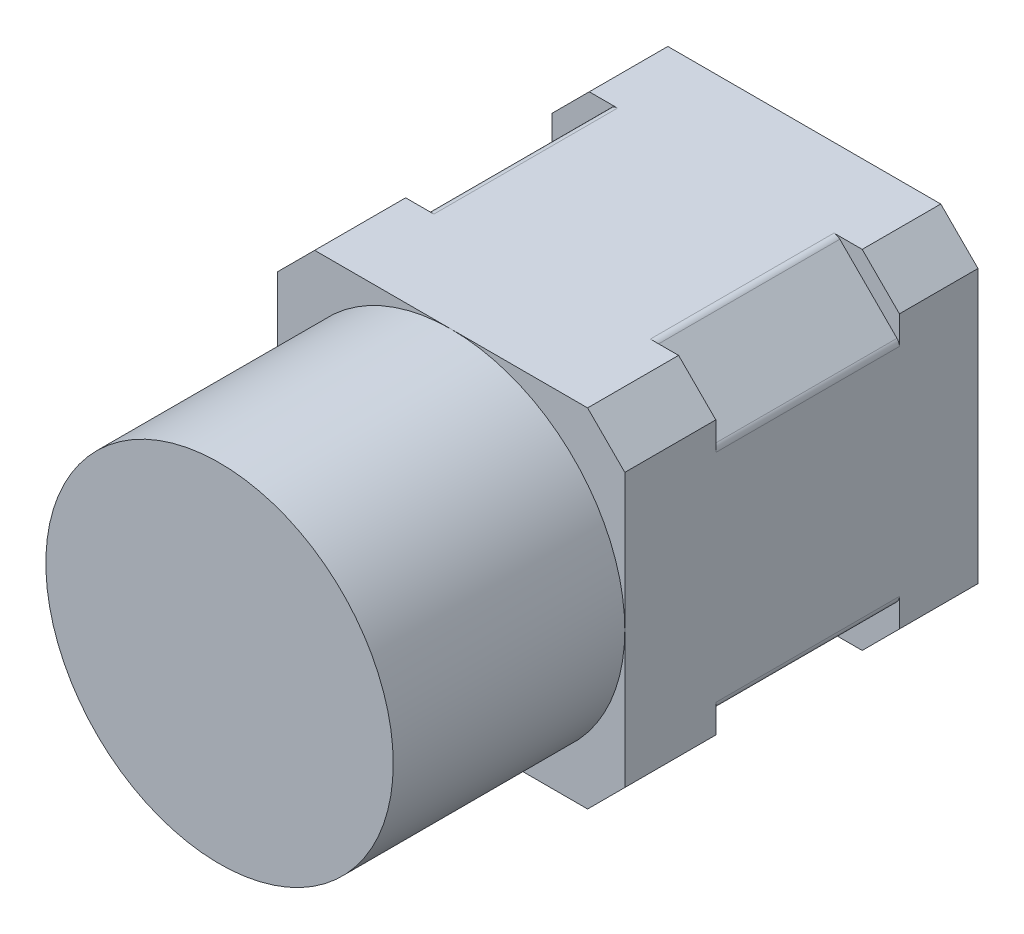
ISO-10303-21;
HEADER;
FILE_DESCRIPTION(('STEP AP214'),'2;1');
FILE_NAME('part.step','',(''),(''),'','','');
FILE_SCHEMA(('AUTOMOTIVE_DESIGN { 1 0 10303 214 1 1 1 1 }'));
ENDSEC;
DATA;
#1=APPLICATION_CONTEXT('core data for automotive mechanical design processes');
#2=APPLICATION_PROTOCOL_DEFINITION('international standard','automotive_design',2000,#1);
#3=PRODUCT_CONTEXT('',#1,'mechanical');
#4=PRODUCT('Part','Part','',(#3));
#5=PRODUCT_RELATED_PRODUCT_CATEGORY('part','',(#4));
#6=PRODUCT_DEFINITION_FORMATION('','',#4);
#7=PRODUCT_DEFINITION_CONTEXT('part definition',#1,'design');
#8=PRODUCT_DEFINITION('design','',#6,#7);
#9=PRODUCT_DEFINITION_SHAPE('','',#8);
#10=(LENGTH_UNIT() NAMED_UNIT(*) SI_UNIT(.MILLI.,.METRE.));
#11=(NAMED_UNIT(*) PLANE_ANGLE_UNIT() SI_UNIT($,.RADIAN.));
#12=(NAMED_UNIT(*) SI_UNIT($,.STERADIAN.) SOLID_ANGLE_UNIT());
#13=UNCERTAINTY_MEASURE_WITH_UNIT(LENGTH_MEASURE(1.E-05),#10,'distance_accuracy_value','');
#14=(GEOMETRIC_REPRESENTATION_CONTEXT(3) GLOBAL_UNCERTAINTY_ASSIGNED_CONTEXT((#13)) GLOBAL_UNIT_ASSIGNED_CONTEXT((#10,
#11,#12)) REPRESENTATION_CONTEXT('',''));
#15=CARTESIAN_POINT('',(0.,0.,0.));
#16=DIRECTION('',(0.,0.,1.));
#17=DIRECTION('',(1.,0.,0.));
#18=AXIS2_PLACEMENT_3D('',#15,#16,#17);
#19=CARTESIAN_POINT('',(0.,0.,33.2));
#20=DIRECTION('',(0.,0.,-1.));
#21=DIRECTION('',(-1.,0.,0.));
#22=AXIS2_PLACEMENT_3D('',#19,#20,#21);
#23=PLANE('',#22);
#24=CARTESIAN_POINT('',(0.,0.,33.2));
#25=DIRECTION('',(0.,0.,1.));
#26=DIRECTION('',(1.,0.,0.));
#27=AXIS2_PLACEMENT_3D('',#24,#25,#26);
#28=CIRCLE('',#27,21.);
#29=CARTESIAN_POINT('',(21.,0.,33.2));
#30=VERTEX_POINT('',#29);
#31=CARTESIAN_POINT('',(0.,21.,33.2));
#32=VERTEX_POINT('',#31);
#33=EDGE_CURVE('E57',#30,#32,#28,.T.);
#34=ORIENTED_EDGE('',*,*,#33,.F.);
#35=DIRECTION('',(0.,1.,0.));
#36=VECTOR('',#35,1.);
#37=CARTESIAN_POINT('',(21.,16.5,33.2));
#38=LINE('',#37,#36);
#39=CARTESIAN_POINT('',(21.,16.5,33.2));
#40=VERTEX_POINT('',#39);
#41=EDGE_CURVE('E277',#30,#40,#38,.T.);
#42=ORIENTED_EDGE('',*,*,#41,.T.);
#43=DIRECTION('',(-0.707106781186549,0.707106781186546,0.));
#44=VECTOR('',#43,1.);
#45=CARTESIAN_POINT('',(16.5,21.,33.2));
#46=LINE('',#45,#44);
#47=CARTESIAN_POINT('',(16.5,21.,33.2));
#48=VERTEX_POINT('',#47);
#49=EDGE_CURVE('E276',#40,#48,#46,.T.);
#50=ORIENTED_EDGE('',*,*,#49,.T.);
#51=DIRECTION('',(-1.,0.,0.));
#52=VECTOR('',#51,1.);
#53=CARTESIAN_POINT('',(-16.5,21.,33.2));
#54=LINE('',#53,#52);
#55=EDGE_CURVE('E290',#48,#32,#54,.T.);
#56=ORIENTED_EDGE('',*,*,#55,.T.);
#57=EDGE_LOOP('',(#34,#42,#50,#56));
#58=FACE_BOUND('',#57,.T.);
#59=ADVANCED_FACE('F45',(#58),#23,.F.);
#60=CARTESIAN_POINT('',(-21.,0.,33.2));
#61=VERTEX_POINT('',#60);
#62=EDGE_CURVE('E11',#32,#61,#28,.T.);
#63=ORIENTED_EDGE('',*,*,#62,.F.);
#64=CARTESIAN_POINT('',(-16.5,21.,33.2));
#65=VERTEX_POINT('',#64);
#66=EDGE_CURVE('E318',#32,#65,#54,.T.);
#67=ORIENTED_EDGE('',*,*,#66,.T.);
#68=DIRECTION('',(-0.707106781186547,-0.707106781186548,0.));
#69=VECTOR('',#68,1.);
#70=CARTESIAN_POINT('',(-21.,16.5,33.2));
#71=LINE('',#70,#69);
#72=CARTESIAN_POINT('',(-21.,16.5,33.2));
#73=VERTEX_POINT('',#72);
#74=EDGE_CURVE('E321',#65,#73,#71,.T.);
#75=ORIENTED_EDGE('',*,*,#74,.T.);
#76=DIRECTION('',(0.,-1.,0.));
#77=VECTOR('',#76,1.);
#78=CARTESIAN_POINT('',(-21.,-16.5,33.2));
#79=LINE('',#78,#77);
#80=EDGE_CURVE('E302',#73,#61,#79,.T.);
#81=ORIENTED_EDGE('',*,*,#80,.T.);
#82=EDGE_LOOP('',(#63,#67,#75,#81));
#83=FACE_BOUND('',#82,.T.);
#84=ADVANCED_FACE('F651',(#83),#23,.F.);
#85=CARTESIAN_POINT('',(0.,-21.,33.2));
#86=VERTEX_POINT('',#85);
#87=EDGE_CURVE('E55',#61,#86,#28,.T.);
#88=ORIENTED_EDGE('',*,*,#87,.F.);
#89=CARTESIAN_POINT('',(-21.,-16.5,33.2));
#90=VERTEX_POINT('',#89);
#91=EDGE_CURVE('E306',#61,#90,#79,.T.);
#92=ORIENTED_EDGE('',*,*,#91,.T.);
#93=DIRECTION('',(0.707106781186549,-0.707106781186546,0.));
#94=VECTOR('',#93,1.);
#95=CARTESIAN_POINT('',(-16.5,-21.,33.2));
#96=LINE('',#95,#94);
#97=CARTESIAN_POINT('',(-16.5,-21.,33.2));
#98=VERTEX_POINT('',#97);
#99=EDGE_CURVE('E305',#90,#98,#96,.T.);
#100=ORIENTED_EDGE('',*,*,#99,.T.);
#101=DIRECTION('',(1.,0.,0.));
#102=VECTOR('',#101,1.);
#103=CARTESIAN_POINT('',(16.5,-21.,33.2));
#104=LINE('',#103,#102);
#105=EDGE_CURVE('E310',#98,#86,#104,.T.);
#106=ORIENTED_EDGE('',*,*,#105,.T.);
#107=EDGE_LOOP('',(#88,#92,#100,#106));
#108=FACE_BOUND('',#107,.T.);
#109=ADVANCED_FACE('F655',(#108),#23,.F.);
#110=CARTESIAN_POINT('',(0.,0.,0.));
#111=DIRECTION('',(0.,0.,-1.));
#112=DIRECTION('',(-1.,0.,0.));
#113=AXIS2_PLACEMENT_3D('',#110,#111,#112);
#114=PLANE('',#113);
#115=DIRECTION('',(-0.707106781186547,-0.707106781186547,0.));
#116=VECTOR('',#115,1.);
#117=CARTESIAN_POINT('',(-13.5,21.,0.));
#118=LINE('',#117,#116);
#119=CARTESIAN_POINT('',(-13.7928932188135,20.7071067811865,0.));
#120=VERTEX_POINT('',#119);
#121=CARTESIAN_POINT('',(-20.7071067811866,13.7928932188135,0.));
#122=VERTEX_POINT('',#121);
#123=EDGE_CURVE('E385',#120,#122,#118,.T.);
#124=ORIENTED_EDGE('',*,*,#123,.F.);
#125=CARTESIAN_POINT('',(-13.0857864376269,20.,0.));
#126=DIRECTION('',(0.,0.,-1.));
#127=DIRECTION('',(-1.,0.,0.));
#128=AXIS2_PLACEMENT_3D('',#125,#126,#127);
#129=CIRCLE('',#128,1.);
#130=CARTESIAN_POINT('',(-13.0857864376269,21.,0.));
#131=VERTEX_POINT('',#130);
#132=EDGE_CURVE('E606',#120,#131,#129,.T.);
#133=ORIENTED_EDGE('',*,*,#132,.T.);
#134=DIRECTION('',(-1.,0.,0.));
#135=VECTOR('',#134,1.);
#136=CARTESIAN_POINT('',(21.,21.,0.));
#137=LINE('',#136,#135);
#138=CARTESIAN_POINT('',(-16.5,21.,0.));
#139=VERTEX_POINT('',#138);
#140=EDGE_CURVE('E439',#131,#139,#137,.T.);
#141=ORIENTED_EDGE('',*,*,#140,.T.);
#142=DIRECTION('',(0.707106781186546,0.707106781186549,0.));
#143=VECTOR('',#142,1.);
#144=CARTESIAN_POINT('',(-16.5,21.,0.));
#145=LINE('',#144,#143);
#146=CARTESIAN_POINT('',(-21.,16.5,0.));
#147=VERTEX_POINT('',#146);
#148=EDGE_CURVE('E459',#139,#147,#145,.F.);
#149=ORIENTED_EDGE('',*,*,#148,.T.);
#150=DIRECTION('',(0.,-1.,0.));
#151=VECTOR('',#150,1.);
#152=CARTESIAN_POINT('',(-21.,21.,0.));
#153=LINE('',#152,#151);
#154=CARTESIAN_POINT('',(-21.,13.0857864376269,0.));
#155=VERTEX_POINT('',#154);
#156=EDGE_CURVE('E444',#147,#155,#153,.T.);
#157=ORIENTED_EDGE('',*,*,#156,.T.);
#158=CARTESIAN_POINT('',(-20.,13.0857864376269,0.));
#159=DIRECTION('',(0.,0.,-1.));
#160=DIRECTION('',(-1.,0.,0.));
#161=AXIS2_PLACEMENT_3D('',#158,#159,#160);
#162=CIRCLE('',#161,1.);
#163=EDGE_CURVE('E603',#155,#122,#162,.T.);
#164=ORIENTED_EDGE('',*,*,#163,.T.);
#165=EDGE_LOOP('',(#124,#133,#141,#149,#157,#164));
#166=FACE_BOUND('',#165,.T.);
#167=ADVANCED_FACE('F665',(#166),#114,.F.);
#168=DIRECTION('',(-0.707106781186547,0.707106781186547,0.));
#169=VECTOR('',#168,1.);
#170=CARTESIAN_POINT('',(21.,13.5,0.));
#171=LINE('',#170,#169);
#172=CARTESIAN_POINT('',(20.7071067811865,13.7928932188135,0.));
#173=VERTEX_POINT('',#172);
#174=CARTESIAN_POINT('',(13.7928932188135,20.7071067811866,0.));
#175=VERTEX_POINT('',#174);
#176=EDGE_CURVE('E391',#173,#175,#171,.T.);
#177=ORIENTED_EDGE('',*,*,#176,.F.);
#178=CARTESIAN_POINT('',(20.,13.0857864376269,0.));
#179=DIRECTION('',(0.,0.,-1.));
#180=DIRECTION('',(-1.,0.,0.));
#181=AXIS2_PLACEMENT_3D('',#178,#179,#180);
#182=CIRCLE('',#181,1.);
#183=CARTESIAN_POINT('',(21.,13.0857864376269,0.));
#184=VERTEX_POINT('',#183);
#185=EDGE_CURVE('E299',#173,#184,#182,.T.);
#186=ORIENTED_EDGE('',*,*,#185,.T.);
#187=DIRECTION('',(0.,1.,0.));
#188=VECTOR('',#187,1.);
#189=CARTESIAN_POINT('',(21.,21.,0.));
#190=LINE('',#189,#188);
#191=CARTESIAN_POINT('',(21.,16.5,0.));
#192=VERTEX_POINT('',#191);
#193=EDGE_CURVE('E403',#184,#192,#190,.T.);
#194=ORIENTED_EDGE('',*,*,#193,.T.);
#195=DIRECTION('',(0.707106781186549,-0.707106781186546,0.));
#196=VECTOR('',#195,1.);
#197=CARTESIAN_POINT('',(21.,16.5,0.));
#198=LINE('',#197,#196);
#199=CARTESIAN_POINT('',(16.5,21.,0.));
#200=VERTEX_POINT('',#199);
#201=EDGE_CURVE('E456',#192,#200,#198,.F.);
#202=ORIENTED_EDGE('',*,*,#201,.T.);
#203=CARTESIAN_POINT('',(13.0857864376269,21.,0.));
#204=VERTEX_POINT('',#203);
#205=EDGE_CURVE('E440',#200,#204,#137,.T.);
#206=ORIENTED_EDGE('',*,*,#205,.T.);
#207=CARTESIAN_POINT('',(13.0857864376269,20.,0.));
#208=DIRECTION('',(0.,0.,-1.));
#209=DIRECTION('',(-1.,0.,0.));
#210=AXIS2_PLACEMENT_3D('',#207,#208,#209);
#211=CIRCLE('',#210,1.);
#212=EDGE_CURVE('E49',#204,#175,#211,.T.);
#213=ORIENTED_EDGE('',*,*,#212,.T.);
#214=EDGE_LOOP('',(#177,#186,#194,#202,#206,#213));
#215=FACE_BOUND('',#214,.T.);
#216=ADVANCED_FACE('F614',(#215),#114,.F.);
#217=DIRECTION('',(0.707106781186547,0.707106781186547,0.));
#218=VECTOR('',#217,1.);
#219=CARTESIAN_POINT('',(21.,-13.5,0.));
#220=LINE('',#219,#218);
#221=CARTESIAN_POINT('',(13.7928932188135,-20.7071067811865,0.));
#222=VERTEX_POINT('',#221);
#223=CARTESIAN_POINT('',(20.7071067811865,-13.7928932188135,0.));
#224=VERTEX_POINT('',#223);
#225=EDGE_CURVE('E411',#222,#224,#220,.T.);
#226=ORIENTED_EDGE('',*,*,#225,.F.);
#227=CARTESIAN_POINT('',(13.0857864376269,-20.,0.));
#228=DIRECTION('',(0.,0.,-1.));
#229=DIRECTION('',(-1.,0.,0.));
#230=AXIS2_PLACEMENT_3D('',#227,#228,#229);
#231=CIRCLE('',#230,1.);
#232=CARTESIAN_POINT('',(13.0857864376269,-21.,0.));
#233=VERTEX_POINT('',#232);
#234=EDGE_CURVE('E592',#222,#233,#231,.T.);
#235=ORIENTED_EDGE('',*,*,#234,.T.);
#236=DIRECTION('',(1.,0.,0.));
#237=VECTOR('',#236,1.);
#238=CARTESIAN_POINT('',(21.,-21.,0.));
#239=LINE('',#238,#237);
#240=CARTESIAN_POINT('',(16.5,-21.,0.));
#241=VERTEX_POINT('',#240);
#242=EDGE_CURVE('E447',#233,#241,#239,.T.);
#243=ORIENTED_EDGE('',*,*,#242,.T.);
#244=DIRECTION('',(-0.707106781186546,-0.707106781186549,0.));
#245=VECTOR('',#244,1.);
#246=CARTESIAN_POINT('',(16.5,-21.,0.));
#247=LINE('',#246,#245);
#248=CARTESIAN_POINT('',(21.,-16.5,0.));
#249=VERTEX_POINT('',#248);
#250=EDGE_CURVE('E462',#241,#249,#247,.F.);
#251=ORIENTED_EDGE('',*,*,#250,.T.);
#252=CARTESIAN_POINT('',(21.,-13.0857864376269,0.));
#253=VERTEX_POINT('',#252);
#254=EDGE_CURVE('E436',#249,#253,#190,.T.);
#255=ORIENTED_EDGE('',*,*,#254,.T.);
#256=CARTESIAN_POINT('',(20.,-13.0857864376269,0.));
#257=DIRECTION('',(0.,0.,-1.));
#258=DIRECTION('',(-1.,0.,0.));
#259=AXIS2_PLACEMENT_3D('',#256,#257,#258);
#260=CIRCLE('',#259,1.);
#261=EDGE_CURVE('E589',#253,#224,#260,.T.);
#262=ORIENTED_EDGE('',*,*,#261,.T.);
#263=EDGE_LOOP('',(#226,#235,#243,#251,#255,#262));
#264=FACE_BOUND('',#263,.T.);
#265=ADVANCED_FACE('F758',(#264),#114,.F.);
#266=DIRECTION('',(0.707106781186547,-0.707106781186547,0.));
#267=VECTOR('',#266,1.);
#268=CARTESIAN_POINT('',(-13.5,-21.,0.));
#269=LINE('',#268,#267);
#270=CARTESIAN_POINT('',(-20.7071067811865,-13.7928932188135,0.));
#271=VERTEX_POINT('',#270);
#272=CARTESIAN_POINT('',(-13.7928932188135,-20.7071067811865,0.));
#273=VERTEX_POINT('',#272);
#274=EDGE_CURVE('E407',#271,#273,#269,.T.);
#275=ORIENTED_EDGE('',*,*,#274,.F.);
#276=CARTESIAN_POINT('',(-20.,-13.0857864376269,0.));
#277=DIRECTION('',(0.,0.,-1.));
#278=DIRECTION('',(-1.,0.,0.));
#279=AXIS2_PLACEMENT_3D('',#276,#277,#278);
#280=CIRCLE('',#279,1.);
#281=CARTESIAN_POINT('',(-21.,-13.0857864376269,0.));
#282=VERTEX_POINT('',#281);
#283=EDGE_CURVE('E599',#271,#282,#280,.T.);
#284=ORIENTED_EDGE('',*,*,#283,.T.);
#285=CARTESIAN_POINT('',(-21.,-16.5,0.));
#286=VERTEX_POINT('',#285);
#287=EDGE_CURVE('E443',#282,#286,#153,.T.);
#288=ORIENTED_EDGE('',*,*,#287,.T.);
#289=DIRECTION('',(-0.707106781186549,0.707106781186546,0.));
#290=VECTOR('',#289,1.);
#291=CARTESIAN_POINT('',(-21.,-16.5,0.));
#292=LINE('',#291,#290);
#293=CARTESIAN_POINT('',(-16.5,-21.,0.));
#294=VERTEX_POINT('',#293);
#295=EDGE_CURVE('E465',#286,#294,#292,.F.);
#296=ORIENTED_EDGE('',*,*,#295,.T.);
#297=CARTESIAN_POINT('',(-13.0857864376269,-21.,0.));
#298=VERTEX_POINT('',#297);
#299=EDGE_CURVE('E423',#294,#298,#239,.T.);
#300=ORIENTED_EDGE('',*,*,#299,.T.);
#301=CARTESIAN_POINT('',(-13.0857864376269,-20.,0.));
#302=DIRECTION('',(0.,0.,-1.));
#303=DIRECTION('',(-1.,0.,0.));
#304=AXIS2_PLACEMENT_3D('',#301,#302,#303);
#305=CIRCLE('',#304,1.);
#306=EDGE_CURVE('E596',#298,#273,#305,.T.);
#307=ORIENTED_EDGE('',*,*,#306,.T.);
#308=EDGE_LOOP('',(#275,#284,#288,#296,#300,#307));
#309=FACE_BOUND('',#308,.T.);
#310=ADVANCED_FACE('F672',(#309),#114,.F.);
#311=CARTESIAN_POINT('',(21.,21.,-9.5));
#312=DIRECTION('',(1.,0.,0.));
#313=DIRECTION('',(0.,1.,0.));
#314=AXIS2_PLACEMENT_3D('',#311,#312,#313);
#315=PLANE('',#314);
#316=DIRECTION('',(0.,0.,-1.));
#317=VECTOR('',#316,1.);
#318=CARTESIAN_POINT('',(21.,13.0857864376269,22.2));
#319=LINE('',#318,#317);
#320=CARTESIAN_POINT('',(21.,13.0857864376269,22.2));
#321=VERTEX_POINT('',#320);
#322=EDGE_CURVE('E501',#184,#321,#319,.F.);
#323=ORIENTED_EDGE('',*,*,#322,.T.);
#324=DIRECTION('',(0.,1.,0.));
#325=VECTOR('',#324,1.);
#326=CARTESIAN_POINT('',(21.,16.5,22.2));
#327=LINE('',#326,#325);
#328=CARTESIAN_POINT('',(21.,16.5,22.2));
#329=VERTEX_POINT('',#328);
#330=EDGE_CURVE('E341',#321,#329,#327,.T.);
#331=ORIENTED_EDGE('',*,*,#330,.T.);
#332=DIRECTION('',(0.,0.,-1.));
#333=VECTOR('',#332,1.);
#334=CARTESIAN_POINT('',(21.,16.5,33.2));
#335=LINE('',#334,#333);
#336=EDGE_CURVE('E283',#40,#329,#335,.T.);
#337=ORIENTED_EDGE('',*,*,#336,.F.);
#338=ORIENTED_EDGE('',*,*,#41,.F.);
#339=CARTESIAN_POINT('',(21.,-16.5,33.2));
#340=VERTEX_POINT('',#339);
#341=EDGE_CURVE('E267',#340,#30,#38,.T.);
#342=ORIENTED_EDGE('',*,*,#341,.F.);
#343=DIRECTION('',(0.,0.,-1.));
#344=VECTOR('',#343,1.);
#345=CARTESIAN_POINT('',(21.,-16.5,33.2));
#346=LINE('',#345,#344);
#347=CARTESIAN_POINT('',(21.,-16.5,22.2));
#348=VERTEX_POINT('',#347);
#349=EDGE_CURVE('E370',#340,#348,#346,.T.);
#350=ORIENTED_EDGE('',*,*,#349,.T.);
#351=CARTESIAN_POINT('',(21.,-13.0857864376269,22.2));
#352=VERTEX_POINT('',#351);
#353=EDGE_CURVE('E342',#348,#352,#327,.T.);
#354=ORIENTED_EDGE('',*,*,#353,.T.);
#355=DIRECTION('',(0.,0.,-1.));
#356=VECTOR('',#355,1.);
#357=CARTESIAN_POINT('',(21.,-13.0857864376269,0.));
#358=LINE('',#357,#356);
#359=EDGE_CURVE('E504',#352,#253,#358,.T.);
#360=ORIENTED_EDGE('',*,*,#359,.T.);
#361=ORIENTED_EDGE('',*,*,#254,.F.);
#362=DIRECTION('',(0.,0.,-1.));
#363=VECTOR('',#362,1.);
#364=CARTESIAN_POINT('',(21.,-16.5,-9.5));
#365=LINE('',#364,#363);
#366=CARTESIAN_POINT('',(21.,-16.5,-9.5));
#367=VERTEX_POINT('',#366);
#368=EDGE_CURVE('E491',#249,#367,#365,.T.);
#369=ORIENTED_EDGE('',*,*,#368,.T.);
#370=DIRECTION('',(0.,1.,0.));
#371=VECTOR('',#370,1.);
#372=CARTESIAN_POINT('',(21.,21.,-9.5));
#373=LINE('',#372,#371);
#374=CARTESIAN_POINT('',(21.,16.5,-9.5));
#375=VERTEX_POINT('',#374);
#376=EDGE_CURVE('E418',#367,#375,#373,.T.);
#377=ORIENTED_EDGE('',*,*,#376,.T.);
#378=DIRECTION('',(0.,0.,1.));
#379=VECTOR('',#378,1.);
#380=CARTESIAN_POINT('',(21.,16.5,-9.5));
#381=LINE('',#380,#379);
#382=EDGE_CURVE('E487',#375,#192,#381,.T.);
#383=ORIENTED_EDGE('',*,*,#382,.T.);
#384=ORIENTED_EDGE('',*,*,#193,.F.);
#385=EDGE_LOOP('',(#323,#331,#337,#338,#342,#350,#354,#360,#361,#369,#377,#383,#384));
#386=FACE_BOUND('',#385,.T.);
#387=ADVANCED_FACE('F281',(#386),#315,.T.);
#388=CARTESIAN_POINT('',(21.,-21.,-9.5));
#389=DIRECTION('',(0.,-1.,0.));
#390=DIRECTION('',(1.,0.,0.));
#391=AXIS2_PLACEMENT_3D('',#388,#389,#390);
#392=PLANE('',#391);
#393=ORIENTED_EDGE('',*,*,#242,.F.);
#394=DIRECTION('',(0.,0.,-1.));
#395=VECTOR('',#394,1.);
#396=CARTESIAN_POINT('',(13.0857864376269,-21.,22.2));
#397=LINE('',#396,#395);
#398=CARTESIAN_POINT('',(13.0857864376269,-21.,22.2));
#399=VERTEX_POINT('',#398);
#400=EDGE_CURVE('E551',#233,#399,#397,.F.);
#401=ORIENTED_EDGE('',*,*,#400,.T.);
#402=DIRECTION('',(1.,0.,0.));
#403=VECTOR('',#402,1.);
#404=CARTESIAN_POINT('',(16.5,-21.,22.2));
#405=LINE('',#404,#403);
#406=CARTESIAN_POINT('',(16.5,-21.,22.2));
#407=VERTEX_POINT('',#406);
#408=EDGE_CURVE('E333',#399,#407,#405,.T.);
#409=ORIENTED_EDGE('',*,*,#408,.T.);
#410=DIRECTION('',(0.,0.,-1.));
#411=VECTOR('',#410,1.);
#412=CARTESIAN_POINT('',(16.5,-21.,33.2));
#413=LINE('',#412,#411);
#414=CARTESIAN_POINT('',(16.5,-21.,33.2));
#415=VERTEX_POINT('',#414);
#416=EDGE_CURVE('E373',#415,#407,#413,.T.);
#417=ORIENTED_EDGE('',*,*,#416,.F.);
#418=EDGE_CURVE('E309',#86,#415,#104,.T.);
#419=ORIENTED_EDGE('',*,*,#418,.F.);
#420=ORIENTED_EDGE('',*,*,#105,.F.);
#421=DIRECTION('',(0.,0.,-1.));
#422=VECTOR('',#421,1.);
#423=CARTESIAN_POINT('',(-16.5,-21.,33.2));
#424=LINE('',#423,#422);
#425=CARTESIAN_POINT('',(-16.5,-21.,22.2));
#426=VERTEX_POINT('',#425);
#427=EDGE_CURVE('E377',#98,#426,#424,.T.);
#428=ORIENTED_EDGE('',*,*,#427,.T.);
#429=CARTESIAN_POINT('',(-13.0857864376269,-21.,22.2));
#430=VERTEX_POINT('',#429);
#431=EDGE_CURVE('E334',#426,#430,#405,.T.);
#432=ORIENTED_EDGE('',*,*,#431,.T.);
#433=DIRECTION('',(0.,0.,-1.));
#434=VECTOR('',#433,1.);
#435=CARTESIAN_POINT('',(-13.0857864376269,-21.,0.));
#436=LINE('',#435,#434);
#437=EDGE_CURVE('E547',#430,#298,#436,.T.);
#438=ORIENTED_EDGE('',*,*,#437,.T.);
#439=ORIENTED_EDGE('',*,*,#299,.F.);
#440=DIRECTION('',(0.,0.,-1.));
#441=VECTOR('',#440,1.);
#442=CARTESIAN_POINT('',(-16.5,-21.,-9.5));
#443=LINE('',#442,#441);
#444=CARTESIAN_POINT('',(-16.5,-21.,-9.5));
#445=VERTEX_POINT('',#444);
#446=EDGE_CURVE('E472',#294,#445,#443,.T.);
#447=ORIENTED_EDGE('',*,*,#446,.T.);
#448=DIRECTION('',(1.,0.,0.));
#449=VECTOR('',#448,1.);
#450=CARTESIAN_POINT('',(21.,-21.,-9.5));
#451=LINE('',#450,#449);
#452=CARTESIAN_POINT('',(16.5,-21.,-9.5));
#453=VERTEX_POINT('',#452);
#454=EDGE_CURVE('E431',#445,#453,#451,.T.);
#455=ORIENTED_EDGE('',*,*,#454,.T.);
#456=DIRECTION('',(0.,0.,1.));
#457=VECTOR('',#456,1.);
#458=CARTESIAN_POINT('',(16.5,-21.,-9.5));
#459=LINE('',#458,#457);
#460=EDGE_CURVE('E468',#453,#241,#459,.T.);
#461=ORIENTED_EDGE('',*,*,#460,.T.);
#462=EDGE_LOOP('',(#393,#401,#409,#417,#419,#420,#428,#432,#438,#439,#447,#455,#461));
#463=FACE_BOUND('',#462,.T.);
#464=ADVANCED_FACE('F722',(#463),#392,.T.);
#465=CARTESIAN_POINT('',(-21.,21.,-9.5));
#466=DIRECTION('',(-1.,0.,0.));
#467=DIRECTION('',(0.,-1.,0.));
#468=AXIS2_PLACEMENT_3D('',#465,#466,#467);
#469=PLANE('',#468);
#470=ORIENTED_EDGE('',*,*,#287,.F.);
#471=DIRECTION('',(0.,0.,-1.));
#472=VECTOR('',#471,1.);
#473=CARTESIAN_POINT('',(-21.,-13.0857864376269,22.2));
#474=LINE('',#473,#472);
#475=CARTESIAN_POINT('',(-21.,-13.0857864376269,22.2));
#476=VERTEX_POINT('',#475);
#477=EDGE_CURVE('E565',#282,#476,#474,.F.);
#478=ORIENTED_EDGE('',*,*,#477,.T.);
#479=DIRECTION('',(0.,-1.,0.));
#480=VECTOR('',#479,1.);
#481=CARTESIAN_POINT('',(-21.,-16.5,22.2));
#482=LINE('',#481,#480);
#483=CARTESIAN_POINT('',(-21.,-16.5,22.2));
#484=VERTEX_POINT('',#483);
#485=EDGE_CURVE('E330',#476,#484,#482,.T.);
#486=ORIENTED_EDGE('',*,*,#485,.T.);
#487=DIRECTION('',(0.,0.,-1.));
#488=VECTOR('',#487,1.);
#489=CARTESIAN_POINT('',(-21.,-16.5,33.2));
#490=LINE('',#489,#488);
#491=EDGE_CURVE('E381',#90,#484,#490,.T.);
#492=ORIENTED_EDGE('',*,*,#491,.F.);
#493=ORIENTED_EDGE('',*,*,#91,.F.);
#494=ORIENTED_EDGE('',*,*,#80,.F.);
#495=DIRECTION('',(0.,0.,-1.));
#496=VECTOR('',#495,1.);
#497=CARTESIAN_POINT('',(-21.,16.5,33.2));
#498=LINE('',#497,#496);
#499=CARTESIAN_POINT('',(-21.,16.5,22.2));
#500=VERTEX_POINT('',#499);
#501=EDGE_CURVE('E324',#73,#500,#498,.T.);
#502=ORIENTED_EDGE('',*,*,#501,.T.);
#503=CARTESIAN_POINT('',(-21.,13.0857864376269,22.2));
#504=VERTEX_POINT('',#503);
#505=EDGE_CURVE('E325',#500,#504,#482,.T.);
#506=ORIENTED_EDGE('',*,*,#505,.T.);
#507=DIRECTION('',(0.,0.,-1.));
#508=VECTOR('',#507,1.);
#509=CARTESIAN_POINT('',(-21.,13.0857864376269,0.));
#510=LINE('',#509,#508);
#511=EDGE_CURVE('E561',#504,#155,#510,.T.);
#512=ORIENTED_EDGE('',*,*,#511,.T.);
#513=ORIENTED_EDGE('',*,*,#156,.F.);
#514=DIRECTION('',(0.,0.,-1.));
#515=VECTOR('',#514,1.);
#516=CARTESIAN_POINT('',(-21.,16.5,-9.5));
#517=LINE('',#516,#515);
#518=CARTESIAN_POINT('',(-21.,16.5,-9.5));
#519=VERTEX_POINT('',#518);
#520=EDGE_CURVE('E435',#147,#519,#517,.T.);
#521=ORIENTED_EDGE('',*,*,#520,.T.);
#522=DIRECTION('',(0.,-1.,0.));
#523=VECTOR('',#522,1.);
#524=CARTESIAN_POINT('',(-21.,21.,-9.5));
#525=LINE('',#524,#523);
#526=CARTESIAN_POINT('',(-21.,-16.5,-9.5));
#527=VERTEX_POINT('',#526);
#528=EDGE_CURVE('E427',#519,#527,#525,.T.);
#529=ORIENTED_EDGE('',*,*,#528,.T.);
#530=DIRECTION('',(0.,0.,1.));
#531=VECTOR('',#530,1.);
#532=CARTESIAN_POINT('',(-21.,-16.5,-9.5));
#533=LINE('',#532,#531);
#534=EDGE_CURVE('E452',#527,#286,#533,.T.);
#535=ORIENTED_EDGE('',*,*,#534,.T.);
#536=EDGE_LOOP('',(#470,#478,#486,#492,#493,#494,#502,#506,#512,#513,#521,#529,#535));
#537=FACE_BOUND('',#536,.T.);
#538=ADVANCED_FACE('F679',(#537),#469,.T.);
#539=CARTESIAN_POINT('',(21.,21.,-9.5));
#540=DIRECTION('',(0.,1.,0.));
#541=DIRECTION('',(-1.,0.,0.));
#542=AXIS2_PLACEMENT_3D('',#539,#540,#541);
#543=PLANE('',#542);
#544=ORIENTED_EDGE('',*,*,#140,.F.);
#545=DIRECTION('',(0.,0.,-1.));
#546=VECTOR('',#545,1.);
#547=CARTESIAN_POINT('',(-13.0857864376269,21.,22.2));
#548=LINE('',#547,#546);
#549=CARTESIAN_POINT('',(-13.0857864376269,21.,22.2));
#550=VERTEX_POINT('',#549);
#551=EDGE_CURVE('E579',#131,#550,#548,.F.);
#552=ORIENTED_EDGE('',*,*,#551,.T.);
#553=DIRECTION('',(-1.,0.,0.));
#554=VECTOR('',#553,1.);
#555=CARTESIAN_POINT('',(-16.5,21.,22.2));
#556=LINE('',#555,#554);
#557=CARTESIAN_POINT('',(-16.5,21.,22.2));
#558=VERTEX_POINT('',#557);
#559=EDGE_CURVE('E349',#550,#558,#556,.T.);
#560=ORIENTED_EDGE('',*,*,#559,.T.);
#561=DIRECTION('',(0.,0.,-1.));
#562=VECTOR('',#561,1.);
#563=CARTESIAN_POINT('',(-16.5,21.,33.2));
#564=LINE('',#563,#562);
#565=EDGE_CURVE('E360',#65,#558,#564,.T.);
#566=ORIENTED_EDGE('',*,*,#565,.F.);
#567=ORIENTED_EDGE('',*,*,#66,.F.);
#568=ORIENTED_EDGE('',*,*,#55,.F.);
#569=DIRECTION('',(0.,0.,-1.));
#570=VECTOR('',#569,1.);
#571=CARTESIAN_POINT('',(16.5,21.,33.2));
#572=LINE('',#571,#570);
#573=CARTESIAN_POINT('',(16.5,21.,22.2));
#574=VERTEX_POINT('',#573);
#575=EDGE_CURVE('E364',#48,#574,#572,.T.);
#576=ORIENTED_EDGE('',*,*,#575,.T.);
#577=CARTESIAN_POINT('',(13.0857864376269,21.,22.2));
#578=VERTEX_POINT('',#577);
#579=EDGE_CURVE('E350',#574,#578,#556,.T.);
#580=ORIENTED_EDGE('',*,*,#579,.T.);
#581=DIRECTION('',(0.,0.,-1.));
#582=VECTOR('',#581,1.);
#583=CARTESIAN_POINT('',(13.0857864376269,21.,0.));
#584=LINE('',#583,#582);
#585=EDGE_CURVE('E575',#578,#204,#584,.T.);
#586=ORIENTED_EDGE('',*,*,#585,.T.);
#587=ORIENTED_EDGE('',*,*,#205,.F.);
#588=DIRECTION('',(0.,0.,-1.));
#589=VECTOR('',#588,1.);
#590=CARTESIAN_POINT('',(16.5,21.,-9.5));
#591=LINE('',#590,#589);
#592=CARTESIAN_POINT('',(16.5,21.,-9.5));
#593=VERTEX_POINT('',#592);
#594=EDGE_CURVE('E494',#200,#593,#591,.T.);
#595=ORIENTED_EDGE('',*,*,#594,.T.);
#596=DIRECTION('',(-1.,0.,0.));
#597=VECTOR('',#596,1.);
#598=CARTESIAN_POINT('',(21.,21.,-9.5));
#599=LINE('',#598,#597);
#600=CARTESIAN_POINT('',(-16.5,21.,-9.5));
#601=VERTEX_POINT('',#600);
#602=EDGE_CURVE('E422',#593,#601,#599,.T.);
#603=ORIENTED_EDGE('',*,*,#602,.T.);
#604=DIRECTION('',(0.,0.,1.));
#605=VECTOR('',#604,1.);
#606=CARTESIAN_POINT('',(-16.5,21.,-9.5));
#607=LINE('',#606,#605);
#608=EDGE_CURVE('E497',#601,#139,#607,.T.);
#609=ORIENTED_EDGE('',*,*,#608,.T.);
#610=EDGE_LOOP('',(#544,#552,#560,#566,#567,#568,#576,#580,#586,#587,#595,#603,#609));
#611=FACE_BOUND('',#610,.T.);
#612=ADVANCED_FACE('F707',(#611),#543,.T.);
#613=CARTESIAN_POINT('',(0.,0.,-9.5));
#614=DIRECTION('',(0.,0.,-1.));
#615=DIRECTION('',(-1.,0.,0.));
#616=AXIS2_PLACEMENT_3D('',#613,#614,#615);
#617=PLANE('',#616);
#618=ORIENTED_EDGE('',*,*,#454,.F.);
#619=DIRECTION('',(0.707106781186549,-0.707106781186546,0.));
#620=VECTOR('',#619,1.);
#621=CARTESIAN_POINT('',(-18.75,-18.75,-9.5));
#622=LINE('',#621,#620);
#623=EDGE_CURVE('E484',#445,#527,#622,.F.);
#624=ORIENTED_EDGE('',*,*,#623,.T.);
#625=ORIENTED_EDGE('',*,*,#528,.F.);
#626=DIRECTION('',(-0.707106781186546,-0.707106781186549,0.));
#627=VECTOR('',#626,1.);
#628=CARTESIAN_POINT('',(-18.75,18.75,-9.5));
#629=LINE('',#628,#627);
#630=EDGE_CURVE('E478',#519,#601,#629,.F.);
#631=ORIENTED_EDGE('',*,*,#630,.T.);
#632=ORIENTED_EDGE('',*,*,#602,.F.);
#633=DIRECTION('',(-0.707106781186549,0.707106781186546,0.));
#634=VECTOR('',#633,1.);
#635=CARTESIAN_POINT('',(18.75,18.75,-9.5));
#636=LINE('',#635,#634);
#637=EDGE_CURVE('E475',#593,#375,#636,.F.);
#638=ORIENTED_EDGE('',*,*,#637,.T.);
#639=ORIENTED_EDGE('',*,*,#376,.F.);
#640=DIRECTION('',(0.707106781186546,0.707106781186549,0.));
#641=VECTOR('',#640,1.);
#642=CARTESIAN_POINT('',(18.75,-18.75,-9.5));
#643=LINE('',#642,#641);
#644=EDGE_CURVE('E481',#367,#453,#643,.F.);
#645=ORIENTED_EDGE('',*,*,#644,.T.);
#646=EDGE_LOOP('',(#618,#624,#625,#631,#632,#638,#639,#645));
#647=FACE_BOUND('',#646,.T.);
#648=ADVANCED_FACE('F704',(#647),#617,.T.);
#649=CARTESIAN_POINT('',(-21.,-16.5,-9.5));
#650=DIRECTION('',(0.707106781186546,0.707106781186549,0.));
#651=DIRECTION('',(0.,0.,1.));
#652=AXIS2_PLACEMENT_3D('',#649,#650,#651);
#653=PLANE('',#652);
#654=ORIENTED_EDGE('',*,*,#623,.F.);
#655=ORIENTED_EDGE('',*,*,#446,.F.);
#656=ORIENTED_EDGE('',*,*,#295,.F.);
#657=ORIENTED_EDGE('',*,*,#534,.F.);
#658=EDGE_LOOP('',(#654,#655,#656,#657));
#659=FACE_BOUND('',#658,.T.);
#660=ADVANCED_FACE('F727',(#659),#653,.F.);
#661=CARTESIAN_POINT('',(16.5,-21.,-9.5));
#662=DIRECTION('',(-0.707106781186549,0.707106781186546,0.));
#663=DIRECTION('',(0.,0.,1.));
#664=AXIS2_PLACEMENT_3D('',#661,#662,#663);
#665=PLANE('',#664);
#666=ORIENTED_EDGE('',*,*,#644,.F.);
#667=ORIENTED_EDGE('',*,*,#368,.F.);
#668=ORIENTED_EDGE('',*,*,#250,.F.);
#669=ORIENTED_EDGE('',*,*,#460,.F.);
#670=EDGE_LOOP('',(#666,#667,#668,#669));
#671=FACE_BOUND('',#670,.T.);
#672=ADVANCED_FACE('F718',(#671),#665,.F.);
#673=CARTESIAN_POINT('',(-16.5,21.,-9.5));
#674=DIRECTION('',(0.707106781186549,-0.707106781186546,0.));
#675=DIRECTION('',(0.,0.,1.));
#676=AXIS2_PLACEMENT_3D('',#673,#674,#675);
#677=PLANE('',#676);
#678=ORIENTED_EDGE('',*,*,#630,.F.);
#679=ORIENTED_EDGE('',*,*,#520,.F.);
#680=ORIENTED_EDGE('',*,*,#148,.F.);
#681=ORIENTED_EDGE('',*,*,#608,.F.);
#682=EDGE_LOOP('',(#678,#679,#680,#681));
#683=FACE_BOUND('',#682,.T.);
#684=ADVANCED_FACE('F699',(#683),#677,.F.);
#685=CARTESIAN_POINT('',(21.,16.5,-9.5));
#686=DIRECTION('',(-0.707106781186546,-0.707106781186549,0.));
#687=DIRECTION('',(0.,0.,1.));
#688=AXIS2_PLACEMENT_3D('',#685,#686,#687);
#689=PLANE('',#688);
#690=ORIENTED_EDGE('',*,*,#637,.F.);
#691=ORIENTED_EDGE('',*,*,#594,.F.);
#692=ORIENTED_EDGE('',*,*,#201,.F.);
#693=ORIENTED_EDGE('',*,*,#382,.F.);
#694=EDGE_LOOP('',(#690,#691,#692,#693));
#695=FACE_BOUND('',#694,.T.);
#696=ADVANCED_FACE('F711',(#695),#689,.F.);
#697=CARTESIAN_POINT('',(-13.5,21.,22.2));
#698=DIRECTION('',(0.707106781186548,-0.707106781186548,0.));
#699=DIRECTION('',(0.707106781186548,0.707106781186548,0.));
#700=AXIS2_PLACEMENT_3D('',#697,#698,#699);
#701=PLANE('',#700);
#702=ORIENTED_EDGE('',*,*,#123,.T.);
#703=DIRECTION('',(0.,0.,-1.));
#704=VECTOR('',#703,1.);
#705=CARTESIAN_POINT('',(-20.7071067811866,13.7928932188135,22.2));
#706=LINE('',#705,#704);
#707=CARTESIAN_POINT('',(-20.7071067811866,13.7928932188135,22.2));
#708=VERTEX_POINT('',#707);
#709=EDGE_CURVE('E572',#122,#708,#706,.F.);
#710=ORIENTED_EDGE('',*,*,#709,.T.);
#711=DIRECTION('',(-0.707106781186547,-0.707106781186547,0.));
#712=VECTOR('',#711,1.);
#713=CARTESIAN_POINT('',(-13.5,21.,22.2));
#714=LINE('',#713,#712);
#715=CARTESIAN_POINT('',(-13.7928932188135,20.7071067811865,22.2));
#716=VERTEX_POINT('',#715);
#717=EDGE_CURVE('E386',#716,#708,#714,.T.);
#718=ORIENTED_EDGE('',*,*,#717,.F.);
#719=DIRECTION('',(0.,0.,-1.));
#720=VECTOR('',#719,1.);
#721=CARTESIAN_POINT('',(-13.7928932188135,20.7071067811865,0.));
#722=LINE('',#721,#720);
#723=EDGE_CURVE('E568',#716,#120,#722,.T.);
#724=ORIENTED_EDGE('',*,*,#723,.T.);
#725=EDGE_LOOP('',(#702,#710,#718,#724));
#726=FACE_BOUND('',#725,.T.);
#727=ADVANCED_FACE('F773',(#726),#701,.F.);
#728=CARTESIAN_POINT('',(-13.5,-21.,22.2));
#729=DIRECTION('',(0.707106781186548,0.707106781186548,0.));
#730=DIRECTION('',(-0.707106781186548,0.707106781186548,0.));
#731=AXIS2_PLACEMENT_3D('',#728,#729,#730);
#732=PLANE('',#731);
#733=ORIENTED_EDGE('',*,*,#274,.T.);
#734=DIRECTION('',(0.,0.,-1.));
#735=VECTOR('',#734,1.);
#736=CARTESIAN_POINT('',(-13.7928932188135,-20.7071067811865,22.2));
#737=LINE('',#736,#735);
#738=CARTESIAN_POINT('',(-13.7928932188135,-20.7071067811865,22.2));
#739=VERTEX_POINT('',#738);
#740=EDGE_CURVE('E558',#273,#739,#737,.F.);
#741=ORIENTED_EDGE('',*,*,#740,.T.);
#742=DIRECTION('',(0.707106781186547,-0.707106781186547,0.));
#743=VECTOR('',#742,1.);
#744=CARTESIAN_POINT('',(-13.5,-21.,22.2));
#745=LINE('',#744,#743);
#746=CARTESIAN_POINT('',(-20.7071067811865,-13.7928932188135,22.2));
#747=VERTEX_POINT('',#746);
#748=EDGE_CURVE('E390',#747,#739,#745,.T.);
#749=ORIENTED_EDGE('',*,*,#748,.F.);
#750=DIRECTION('',(0.,0.,-1.));
#751=VECTOR('',#750,1.);
#752=CARTESIAN_POINT('',(-20.7071067811865,-13.7928932188135,0.));
#753=LINE('',#752,#751);
#754=EDGE_CURVE('E554',#747,#271,#753,.T.);
#755=ORIENTED_EDGE('',*,*,#754,.T.);
#756=EDGE_LOOP('',(#733,#741,#749,#755));
#757=FACE_BOUND('',#756,.T.);
#758=ADVANCED_FACE('F775',(#757),#732,.F.);
#759=CARTESIAN_POINT('',(21.,-13.5,22.2));
#760=DIRECTION('',(-0.707106781186548,0.707106781186548,0.));
#761=DIRECTION('',(-0.707106781186548,-0.707106781186548,0.));
#762=AXIS2_PLACEMENT_3D('',#759,#760,#761);
#763=PLANE('',#762);
#764=ORIENTED_EDGE('',*,*,#225,.T.);
#765=DIRECTION('',(0.,0.,-1.));
#766=VECTOR('',#765,1.);
#767=CARTESIAN_POINT('',(20.7071067811865,-13.7928932188135,22.2));
#768=LINE('',#767,#766);
#769=CARTESIAN_POINT('',(20.7071067811865,-13.7928932188135,22.2));
#770=VERTEX_POINT('',#769);
#771=EDGE_CURVE('E512',#224,#770,#768,.F.);
#772=ORIENTED_EDGE('',*,*,#771,.T.);
#773=DIRECTION('',(0.707106781186547,0.707106781186547,0.));
#774=VECTOR('',#773,1.);
#775=CARTESIAN_POINT('',(21.,-13.5,22.2));
#776=LINE('',#775,#774);
#777=CARTESIAN_POINT('',(13.7928932188135,-20.7071067811865,22.2));
#778=VERTEX_POINT('',#777);
#779=EDGE_CURVE('E395',#778,#770,#776,.T.);
#780=ORIENTED_EDGE('',*,*,#779,.F.);
#781=DIRECTION('',(0.,0.,-1.));
#782=VECTOR('',#781,1.);
#783=CARTESIAN_POINT('',(13.7928932188135,-20.7071067811865,0.));
#784=LINE('',#783,#782);
#785=EDGE_CURVE('E508',#778,#222,#784,.T.);
#786=ORIENTED_EDGE('',*,*,#785,.T.);
#787=EDGE_LOOP('',(#764,#772,#780,#786));
#788=FACE_BOUND('',#787,.T.);
#789=ADVANCED_FACE('F760',(#788),#763,.F.);
#790=CARTESIAN_POINT('',(21.,13.5,22.2));
#791=DIRECTION('',(-0.707106781186548,-0.707106781186548,0.));
#792=DIRECTION('',(0.707106781186548,-0.707106781186548,0.));
#793=AXIS2_PLACEMENT_3D('',#790,#791,#792);
#794=PLANE('',#793);
#795=DIRECTION('',(-0.707106781186547,0.707106781186547,0.));
#796=VECTOR('',#795,1.);
#797=CARTESIAN_POINT('',(21.,13.5,22.2));
#798=LINE('',#797,#796);
#799=CARTESIAN_POINT('',(20.7071067811865,13.7928932188135,22.2));
#800=VERTEX_POINT('',#799);
#801=CARTESIAN_POINT('',(13.7928932188135,20.7071067811866,22.2));
#802=VERTEX_POINT('',#801);
#803=EDGE_CURVE('E399',#800,#802,#798,.T.);
#804=ORIENTED_EDGE('',*,*,#803,.F.);
#805=DIRECTION('',(0.,0.,-1.));
#806=VECTOR('',#805,1.);
#807=CARTESIAN_POINT('',(20.7071067811865,13.7928932188135,0.));
#808=LINE('',#807,#806);
#809=EDGE_CURVE('E585',#800,#173,#808,.T.);
#810=ORIENTED_EDGE('',*,*,#809,.T.);
#811=ORIENTED_EDGE('',*,*,#176,.T.);
#812=DIRECTION('',(0.,0.,-1.));
#813=VECTOR('',#812,1.);
#814=CARTESIAN_POINT('',(13.7928932188135,20.7071067811866,22.2));
#815=LINE('',#814,#813);
#816=EDGE_CURVE('E582',#175,#802,#815,.F.);
#817=ORIENTED_EDGE('',*,*,#816,.T.);
#818=EDGE_LOOP('',(#804,#810,#811,#817));
#819=FACE_BOUND('',#818,.T.);
#820=ADVANCED_FACE('F816',(#819),#794,.F.);
#821=CARTESIAN_POINT('',(20.,-13.0857864376269,-9.5));
#822=DIRECTION('',(0.,0.,1.));
#823=DIRECTION('',(1.,0.,0.));
#824=AXIS2_PLACEMENT_3D('',#821,#822,#823);
#825=CYLINDRICAL_SURFACE('',#824,1.);
#826=CARTESIAN_POINT('',(20.,-13.0857864376269,22.2));
#827=DIRECTION('',(0.,0.,-1.));
#828=DIRECTION('',(-1.,0.,0.));
#829=AXIS2_PLACEMENT_3D('',#826,#827,#828);
#830=CIRCLE('',#829,1.);
#831=EDGE_CURVE('E543',#770,#352,#830,.F.);
#832=ORIENTED_EDGE('',*,*,#831,.F.);
#833=ORIENTED_EDGE('',*,*,#771,.F.);
#834=ORIENTED_EDGE('',*,*,#261,.F.);
#835=ORIENTED_EDGE('',*,*,#359,.F.);
#836=EDGE_LOOP('',(#832,#833,#834,#835));
#837=FACE_BOUND('',#836,.T.);
#838=ADVANCED_FACE('F754',(#837),#825,.T.);
#839=CARTESIAN_POINT('',(13.0857864376269,-20.,22.2));
#840=DIRECTION('',(0.,0.,1.));
#841=DIRECTION('',(1.,0.,0.));
#842=AXIS2_PLACEMENT_3D('',#839,#840,#841);
#843=CYLINDRICAL_SURFACE('',#842,1.);
#844=CARTESIAN_POINT('',(13.0857864376269,-20.,22.2));
#845=DIRECTION('',(0.,0.,-1.));
#846=DIRECTION('',(-1.,0.,0.));
#847=AXIS2_PLACEMENT_3D('',#844,#845,#846);
#848=CIRCLE('',#847,1.);
#849=EDGE_CURVE('E539',#399,#778,#848,.F.);
#850=ORIENTED_EDGE('',*,*,#849,.F.);
#851=ORIENTED_EDGE('',*,*,#400,.F.);
#852=ORIENTED_EDGE('',*,*,#234,.F.);
#853=ORIENTED_EDGE('',*,*,#785,.F.);
#854=EDGE_LOOP('',(#850,#851,#852,#853));
#855=FACE_BOUND('',#854,.T.);
#856=ADVANCED_FACE('F763',(#855),#843,.T.);
#857=CARTESIAN_POINT('',(-13.0857864376269,-20.,-9.5));
#858=DIRECTION('',(0.,0.,1.));
#859=DIRECTION('',(1.,0.,0.));
#860=AXIS2_PLACEMENT_3D('',#857,#858,#859);
#861=CYLINDRICAL_SURFACE('',#860,1.);
#862=CARTESIAN_POINT('',(-13.0857864376269,-20.,22.2));
#863=DIRECTION('',(0.,0.,-1.));
#864=DIRECTION('',(-1.,0.,0.));
#865=AXIS2_PLACEMENT_3D('',#862,#863,#864);
#866=CIRCLE('',#865,1.);
#867=EDGE_CURVE('E535',#739,#430,#866,.F.);
#868=ORIENTED_EDGE('',*,*,#867,.F.);
#869=ORIENTED_EDGE('',*,*,#740,.F.);
#870=ORIENTED_EDGE('',*,*,#306,.F.);
#871=ORIENTED_EDGE('',*,*,#437,.F.);
#872=EDGE_LOOP('',(#868,#869,#870,#871));
#873=FACE_BOUND('',#872,.T.);
#874=ADVANCED_FACE('F819',(#873),#861,.T.);
#875=CARTESIAN_POINT('',(-20.,-13.0857864376269,22.2));
#876=DIRECTION('',(0.,0.,1.));
#877=DIRECTION('',(1.,0.,0.));
#878=AXIS2_PLACEMENT_3D('',#875,#876,#877);
#879=CYLINDRICAL_SURFACE('',#878,1.);
#880=CARTESIAN_POINT('',(-20.,-13.0857864376269,22.2));
#881=DIRECTION('',(0.,0.,-1.));
#882=DIRECTION('',(-1.,0.,0.));
#883=AXIS2_PLACEMENT_3D('',#880,#881,#882);
#884=CIRCLE('',#883,1.);
#885=EDGE_CURVE('E531',#476,#747,#884,.F.);
#886=ORIENTED_EDGE('',*,*,#885,.F.);
#887=ORIENTED_EDGE('',*,*,#477,.F.);
#888=ORIENTED_EDGE('',*,*,#283,.F.);
#889=ORIENTED_EDGE('',*,*,#754,.F.);
#890=EDGE_LOOP('',(#886,#887,#888,#889));
#891=FACE_BOUND('',#890,.T.);
#892=ADVANCED_FACE('F736',(#891),#879,.T.);
#893=CARTESIAN_POINT('',(-20.,13.0857864376269,-9.5));
#894=DIRECTION('',(0.,0.,1.));
#895=DIRECTION('',(1.,0.,0.));
#896=AXIS2_PLACEMENT_3D('',#893,#894,#895);
#897=CYLINDRICAL_SURFACE('',#896,1.);
#898=CARTESIAN_POINT('',(-20.,13.0857864376269,22.2));
#899=DIRECTION('',(0.,0.,-1.));
#900=DIRECTION('',(-1.,0.,0.));
#901=AXIS2_PLACEMENT_3D('',#898,#899,#900);
#902=CIRCLE('',#901,1.);
#903=EDGE_CURVE('E527',#708,#504,#902,.F.);
#904=ORIENTED_EDGE('',*,*,#903,.F.);
#905=ORIENTED_EDGE('',*,*,#709,.F.);
#906=ORIENTED_EDGE('',*,*,#163,.F.);
#907=ORIENTED_EDGE('',*,*,#511,.F.);
#908=EDGE_LOOP('',(#904,#905,#906,#907));
#909=FACE_BOUND('',#908,.T.);
#910=ADVANCED_FACE('F691',(#909),#897,.T.);
#911=CARTESIAN_POINT('',(-13.0857864376269,20.,22.2));
#912=DIRECTION('',(0.,0.,1.));
#913=DIRECTION('',(1.,0.,0.));
#914=AXIS2_PLACEMENT_3D('',#911,#912,#913);
#915=CYLINDRICAL_SURFACE('',#914,1.);
#916=CARTESIAN_POINT('',(-13.0857864376269,20.,22.2));
#917=DIRECTION('',(0.,0.,-1.));
#918=DIRECTION('',(-1.,0.,0.));
#919=AXIS2_PLACEMENT_3D('',#916,#917,#918);
#920=CIRCLE('',#919,1.);
#921=EDGE_CURVE('E523',#550,#716,#920,.F.);
#922=ORIENTED_EDGE('',*,*,#921,.F.);
#923=ORIENTED_EDGE('',*,*,#551,.F.);
#924=ORIENTED_EDGE('',*,*,#132,.F.);
#925=ORIENTED_EDGE('',*,*,#723,.F.);
#926=EDGE_LOOP('',(#922,#923,#924,#925));
#927=FACE_BOUND('',#926,.T.);
#928=ADVANCED_FACE('F771',(#927),#915,.T.);
#929=CARTESIAN_POINT('',(20.,13.0857864376269,22.2));
#930=DIRECTION('',(0.,0.,1.));
#931=DIRECTION('',(1.,0.,0.));
#932=AXIS2_PLACEMENT_3D('',#929,#930,#931);
#933=CYLINDRICAL_SURFACE('',#932,1.);
#934=CARTESIAN_POINT('',(20.,13.0857864376269,22.2));
#935=DIRECTION('',(0.,0.,-1.));
#936=DIRECTION('',(-1.,0.,0.));
#937=AXIS2_PLACEMENT_3D('',#934,#935,#936);
#938=CIRCLE('',#937,1.);
#939=EDGE_CURVE('E519',#321,#800,#938,.F.);
#940=ORIENTED_EDGE('',*,*,#939,.F.);
#941=ORIENTED_EDGE('',*,*,#322,.F.);
#942=ORIENTED_EDGE('',*,*,#185,.F.);
#943=ORIENTED_EDGE('',*,*,#809,.F.);
#944=EDGE_LOOP('',(#940,#941,#942,#943));
#945=FACE_BOUND('',#944,.T.);
#946=ADVANCED_FACE('F619',(#945),#933,.T.);
#947=CARTESIAN_POINT('',(13.0857864376269,20.,-9.5));
#948=DIRECTION('',(0.,0.,1.));
#949=DIRECTION('',(1.,0.,0.));
#950=AXIS2_PLACEMENT_3D('',#947,#948,#949);
#951=CYLINDRICAL_SURFACE('',#950,1.);
#952=CARTESIAN_POINT('',(13.0857864376269,20.,22.2));
#953=DIRECTION('',(0.,0.,-1.));
#954=DIRECTION('',(-1.,0.,0.));
#955=AXIS2_PLACEMENT_3D('',#952,#953,#954);
#956=CIRCLE('',#955,1.);
#957=EDGE_CURVE('E515',#802,#578,#956,.F.);
#958=ORIENTED_EDGE('',*,*,#957,.F.);
#959=ORIENTED_EDGE('',*,*,#816,.F.);
#960=ORIENTED_EDGE('',*,*,#212,.F.);
#961=ORIENTED_EDGE('',*,*,#585,.F.);
#962=EDGE_LOOP('',(#958,#959,#960,#961));
#963=FACE_BOUND('',#962,.T.);
#964=ADVANCED_FACE('F47',(#963),#951,.T.);
#965=CARTESIAN_POINT('',(0.,0.,22.2));
#966=DIRECTION('',(0.,0.,-1.));
#967=DIRECTION('',(-1.,0.,0.));
#968=AXIS2_PLACEMENT_3D('',#965,#966,#967);
#969=PLANE('',#968);
#970=ORIENTED_EDGE('',*,*,#330,.F.);
#971=ORIENTED_EDGE('',*,*,#939,.T.);
#972=ORIENTED_EDGE('',*,*,#803,.T.);
#973=ORIENTED_EDGE('',*,*,#957,.T.);
#974=ORIENTED_EDGE('',*,*,#579,.F.);
#975=DIRECTION('',(-0.707106781186549,0.707106781186546,0.));
#976=VECTOR('',#975,1.);
#977=CARTESIAN_POINT('',(16.5,21.,22.2));
#978=LINE('',#977,#976);
#979=EDGE_CURVE('E346',#329,#574,#978,.T.);
#980=ORIENTED_EDGE('',*,*,#979,.F.);
#981=EDGE_LOOP('',(#970,#971,#972,#973,#974,#980));
#982=FACE_BOUND('',#981,.T.);
#983=ADVANCED_FACE('F647',(#982),#969,.T.);
#984=ORIENTED_EDGE('',*,*,#559,.F.);
#985=ORIENTED_EDGE('',*,*,#921,.T.);
#986=ORIENTED_EDGE('',*,*,#717,.T.);
#987=ORIENTED_EDGE('',*,*,#903,.T.);
#988=ORIENTED_EDGE('',*,*,#505,.F.);
#989=DIRECTION('',(-0.707106781186547,-0.707106781186548,0.));
#990=VECTOR('',#989,1.);
#991=CARTESIAN_POINT('',(-21.,16.5,22.2));
#992=LINE('',#991,#990);
#993=EDGE_CURVE('E354',#558,#500,#992,.T.);
#994=ORIENTED_EDGE('',*,*,#993,.F.);
#995=EDGE_LOOP('',(#984,#985,#986,#987,#988,#994));
#996=FACE_BOUND('',#995,.T.);
#997=ADVANCED_FACE('F687',(#996),#969,.T.);
#998=ORIENTED_EDGE('',*,*,#485,.F.);
#999=ORIENTED_EDGE('',*,*,#885,.T.);
#1000=ORIENTED_EDGE('',*,*,#748,.T.);
#1001=ORIENTED_EDGE('',*,*,#867,.T.);
#1002=ORIENTED_EDGE('',*,*,#431,.F.);
#1003=DIRECTION('',(0.707106781186549,-0.707106781186546,0.));
#1004=VECTOR('',#1003,1.);
#1005=CARTESIAN_POINT('',(-16.5,-21.,22.2));
#1006=LINE('',#1005,#1004);
#1007=EDGE_CURVE('E329',#484,#426,#1006,.T.);
#1008=ORIENTED_EDGE('',*,*,#1007,.F.);
#1009=EDGE_LOOP('',(#998,#999,#1000,#1001,#1002,#1008));
#1010=FACE_BOUND('',#1009,.T.);
#1011=ADVANCED_FACE('F648',(#1010),#969,.T.);
#1012=CARTESIAN_POINT('',(-16.5,-21.,33.2));
#1013=DIRECTION('',(0.707106781186546,0.707106781186549,0.));
#1014=DIRECTION('',(-0.707106781186549,0.707106781186546,0.));
#1015=AXIS2_PLACEMENT_3D('',#1012,#1013,#1014);
#1016=PLANE('',#1015);
#1017=ORIENTED_EDGE('',*,*,#1007,.T.);
#1018=ORIENTED_EDGE('',*,*,#427,.F.);
#1019=ORIENTED_EDGE('',*,*,#99,.F.);
#1020=ORIENTED_EDGE('',*,*,#491,.T.);
#1021=EDGE_LOOP('',(#1017,#1018,#1019,#1020));
#1022=FACE_BOUND('',#1021,.T.);
#1023=ADVANCED_FACE('F743',(#1022),#1016,.F.);
#1024=CARTESIAN_POINT('',(21.,-16.5,33.2));
#1025=DIRECTION('',(-0.70710678118655,0.707106781186545,0.));
#1026=DIRECTION('',(-0.707106781186545,-0.70710678118655,0.));
#1027=AXIS2_PLACEMENT_3D('',#1024,#1025,#1026);
#1028=PLANE('',#1027);
#1029=DIRECTION('',(0.707106781186545,0.70710678118655,0.));
#1030=VECTOR('',#1029,1.);
#1031=CARTESIAN_POINT('',(21.,-16.5,22.2));
#1032=LINE('',#1031,#1030);
#1033=EDGE_CURVE('E338',#407,#348,#1032,.T.);
#1034=ORIENTED_EDGE('',*,*,#1033,.T.);
#1035=ORIENTED_EDGE('',*,*,#349,.F.);
#1036=DIRECTION('',(0.707106781186545,0.70710678118655,0.));
#1037=VECTOR('',#1036,1.);
#1038=CARTESIAN_POINT('',(21.,-16.5,33.2));
#1039=LINE('',#1038,#1037);
#1040=EDGE_CURVE('E271',#415,#340,#1039,.T.);
#1041=ORIENTED_EDGE('',*,*,#1040,.F.);
#1042=ORIENTED_EDGE('',*,*,#416,.T.);
#1043=EDGE_LOOP('',(#1034,#1035,#1041,#1042));
#1044=FACE_BOUND('',#1043,.T.);
#1045=ADVANCED_FACE('F748',(#1044),#1028,.F.);
#1046=CARTESIAN_POINT('',(16.5,21.,33.2));
#1047=DIRECTION('',(-0.707106781186546,-0.707106781186549,0.));
#1048=DIRECTION('',(0.707106781186549,-0.707106781186546,0.));
#1049=AXIS2_PLACEMENT_3D('',#1046,#1047,#1048);
#1050=PLANE('',#1049);
#1051=ORIENTED_EDGE('',*,*,#979,.T.);
#1052=ORIENTED_EDGE('',*,*,#575,.F.);
#1053=ORIENTED_EDGE('',*,*,#49,.F.);
#1054=ORIENTED_EDGE('',*,*,#336,.T.);
#1055=EDGE_LOOP('',(#1051,#1052,#1053,#1054));
#1056=FACE_BOUND('',#1055,.T.);
#1057=ADVANCED_FACE('F661',(#1056),#1050,.F.);
#1058=CARTESIAN_POINT('',(-21.,16.5,33.2));
#1059=DIRECTION('',(0.707106781186548,-0.707106781186547,0.));
#1060=DIRECTION('',(0.707106781186547,0.707106781186548,0.));
#1061=AXIS2_PLACEMENT_3D('',#1058,#1059,#1060);
#1062=PLANE('',#1061);
#1063=ORIENTED_EDGE('',*,*,#993,.T.);
#1064=ORIENTED_EDGE('',*,*,#501,.F.);
#1065=ORIENTED_EDGE('',*,*,#74,.F.);
#1066=ORIENTED_EDGE('',*,*,#565,.T.);
#1067=EDGE_LOOP('',(#1063,#1064,#1065,#1066));
#1068=FACE_BOUND('',#1067,.T.);
#1069=ADVANCED_FACE('F657',(#1068),#1062,.F.);
#1070=EDGE_CURVE('E70',#86,#30,#28,.T.);
#1071=ORIENTED_EDGE('',*,*,#1070,.F.);
#1072=ORIENTED_EDGE('',*,*,#418,.T.);
#1073=ORIENTED_EDGE('',*,*,#1040,.T.);
#1074=ORIENTED_EDGE('',*,*,#341,.T.);
#1075=EDGE_LOOP('',(#1071,#1072,#1073,#1074));
#1076=FACE_BOUND('',#1075,.T.);
#1077=ADVANCED_FACE('F269',(#1076),#23,.F.);
#1078=ORIENTED_EDGE('',*,*,#779,.T.);
#1079=ORIENTED_EDGE('',*,*,#831,.T.);
#1080=ORIENTED_EDGE('',*,*,#353,.F.);
#1081=ORIENTED_EDGE('',*,*,#1033,.F.);
#1082=ORIENTED_EDGE('',*,*,#408,.F.);
#1083=ORIENTED_EDGE('',*,*,#849,.T.);
#1084=EDGE_LOOP('',(#1078,#1079,#1080,#1081,#1082,#1083));
#1085=FACE_BOUND('',#1084,.T.);
#1086=ADVANCED_FACE('F638',(#1085),#969,.T.);
#1087=CARTESIAN_POINT('',(0.,0.,61.2));
#1088=DIRECTION('',(0.,0.,-1.));
#1089=DIRECTION('',(-1.,0.,0.));
#1090=AXIS2_PLACEMENT_3D('',#1087,#1088,#1089);
#1091=CYLINDRICAL_SURFACE('',#1090,21.);
#1092=CARTESIAN_POINT('',(0.,0.,61.2));
#1093=DIRECTION('',(0.,0.,1.));
#1094=DIRECTION('',(1.,0.,0.));
#1095=AXIS2_PLACEMENT_3D('',#1092,#1093,#1094);
#1096=CIRCLE('',#1095,21.);
#1097=CARTESIAN_POINT('',(21.,0.,61.2));
#1098=VERTEX_POINT('',#1097);
#1099=EDGE_CURVE('E293',#1098,#1098,#1096,.T.);
#1100=ORIENTED_EDGE('',*,*,#1099,.F.);
#1101=EDGE_LOOP('',(#1100));
#1102=FACE_BOUND('',#1101,.T.);
#1103=ORIENTED_EDGE('',*,*,#33,.T.);
#1104=ORIENTED_EDGE('',*,*,#62,.T.);
#1105=ORIENTED_EDGE('',*,*,#87,.T.);
#1106=ORIENTED_EDGE('',*,*,#1070,.T.);
#1107=EDGE_LOOP('',(#1103,#1104,#1105,#1106));
#1108=FACE_BOUND('',#1107,.T.);
#1109=ADVANCED_FACE('F295',(#1102,#1108),#1091,.T.);
#1110=CARTESIAN_POINT('',(0.,0.,61.2));
#1111=DIRECTION('',(0.,0.,1.));
#1112=DIRECTION('',(1.,0.,0.));
#1113=AXIS2_PLACEMENT_3D('',#1110,#1111,#1112);
#1114=PLANE('',#1113);
#1115=ORIENTED_EDGE('',*,*,#1099,.T.);
#1116=EDGE_LOOP('',(#1115));
#1117=FACE_BOUND('',#1116,.T.);
#1118=ADVANCED_FACE('F635',(#1117),#1114,.T.);
#1119=CLOSED_SHELL('',(#59,#84,#109,#167,#216,#265,#310,#387,#464,#538,#612,#648,#660,#672,#684,
#696,#727,#758,#789,#820,#838,#856,#874,#892,#910,#928,#946,#964,#983,#997,#1011,#1023,#1045,
#1057,#1069,#1077,#1086,#1109,#1118));
#1120=MANIFOLD_SOLID_BREP('B2',#1119);
#1121=ADVANCED_BREP_SHAPE_REPRESENTATION('',(#18,#1120),#14);
#1122=SHAPE_DEFINITION_REPRESENTATION(#9,#1121);
ENDSEC;
END-ISO-10303-21;
